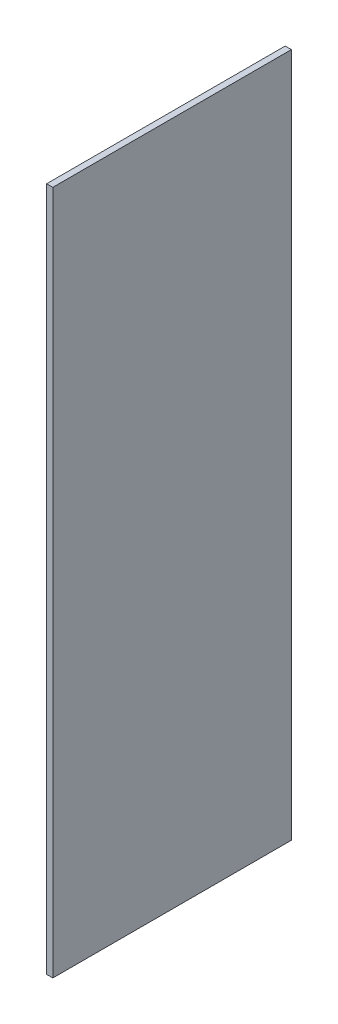
ISO-10303-21;
HEADER;
FILE_DESCRIPTION(('STEP AP214'),'2;1');
FILE_NAME('part.step','',(''),(''),'','','');
FILE_SCHEMA(('AUTOMOTIVE_DESIGN { 1 0 10303 214 1 1 1 1 }'));
ENDSEC;
DATA;
#1=APPLICATION_CONTEXT('core data for automotive mechanical design processes');
#2=APPLICATION_PROTOCOL_DEFINITION('international standard','automotive_design',2000,#1);
#3=PRODUCT_CONTEXT('',#1,'mechanical');
#4=PRODUCT('Part','Part','',(#3));
#5=PRODUCT_RELATED_PRODUCT_CATEGORY('part','',(#4));
#6=PRODUCT_DEFINITION_FORMATION('','',#4);
#7=PRODUCT_DEFINITION_CONTEXT('part definition',#1,'design');
#8=PRODUCT_DEFINITION('design','',#6,#7);
#9=PRODUCT_DEFINITION_SHAPE('','',#8);
#10=(LENGTH_UNIT() NAMED_UNIT(*) SI_UNIT(.MILLI.,.METRE.));
#11=(NAMED_UNIT(*) PLANE_ANGLE_UNIT() SI_UNIT($,.RADIAN.));
#12=(NAMED_UNIT(*) SI_UNIT($,.STERADIAN.) SOLID_ANGLE_UNIT());
#13=UNCERTAINTY_MEASURE_WITH_UNIT(LENGTH_MEASURE(1.E-05),#10,'distance_accuracy_value','');
#14=(GEOMETRIC_REPRESENTATION_CONTEXT(3) GLOBAL_UNCERTAINTY_ASSIGNED_CONTEXT((#13)) GLOBAL_UNIT_ASSIGNED_CONTEXT((#10,
#11,#12)) REPRESENTATION_CONTEXT('',''));
#15=CARTESIAN_POINT('',(0.,0.,0.));
#16=DIRECTION('',(0.,0.,1.));
#17=DIRECTION('',(1.,0.,0.));
#18=AXIS2_PLACEMENT_3D('',#15,#16,#17);
#19=CARTESIAN_POINT('',(4.,0.,0.));
#20=DIRECTION('',(0.,0.,-1.));
#21=DIRECTION('',(-1.,0.,0.));
#22=AXIS2_PLACEMENT_3D('',#19,#20,#21);
#23=PLANE('',#22);
#24=DIRECTION('',(0.,-1.,0.));
#25=VECTOR('',#24,1.);
#26=CARTESIAN_POINT('',(0.,0.,0.));
#27=LINE('',#26,#25);
#28=CARTESIAN_POINT('',(0.,442.,0.));
#29=VERTEX_POINT('',#28);
#30=CARTESIAN_POINT('',(0.,0.,0.));
#31=VERTEX_POINT('',#30);
#32=EDGE_CURVE('E117',#29,#31,#27,.T.);
#33=ORIENTED_EDGE('',*,*,#32,.T.);
#34=DIRECTION('',(-1.,0.,0.));
#35=VECTOR('',#34,1.);
#36=CARTESIAN_POINT('',(4.,0.,0.));
#37=LINE('',#36,#35);
#38=CARTESIAN_POINT('',(4.,0.,0.));
#39=VERTEX_POINT('',#38);
#40=EDGE_CURVE('E11',#39,#31,#37,.T.);
#41=ORIENTED_EDGE('',*,*,#40,.F.);
#42=DIRECTION('',(0.,-1.,0.));
#43=VECTOR('',#42,1.);
#44=CARTESIAN_POINT('',(4.,0.,0.));
#45=LINE('',#44,#43);
#46=CARTESIAN_POINT('',(4.,442.,0.));
#47=VERTEX_POINT('',#46);
#48=EDGE_CURVE('E101',#47,#39,#45,.T.);
#49=ORIENTED_EDGE('',*,*,#48,.F.);
#50=DIRECTION('',(-1.,0.,0.));
#51=VECTOR('',#50,1.);
#52=CARTESIAN_POINT('',(4.,442.,0.));
#53=LINE('',#52,#51);
#54=EDGE_CURVE('E113',#47,#29,#53,.T.);
#55=ORIENTED_EDGE('',*,*,#54,.T.);
#56=EDGE_LOOP('',(#33,#41,#49,#55));
#57=FACE_BOUND('',#56,.T.);
#58=ADVANCED_FACE('F49',(#57),#23,.F.);
#59=CARTESIAN_POINT('',(4.,0.,0.));
#60=DIRECTION('',(0.,1.,0.));
#61=DIRECTION('',(0.,0.,1.));
#62=AXIS2_PLACEMENT_3D('',#59,#60,#61);
#63=PLANE('',#62);
#64=DIRECTION('',(0.,0.,-1.));
#65=VECTOR('',#64,1.);
#66=CARTESIAN_POINT('',(0.,0.,0.));
#67=LINE('',#66,#65);
#68=CARTESIAN_POINT('',(0.,0.,-154.));
#69=VERTEX_POINT('',#68);
#70=EDGE_CURVE('E106',#31,#69,#67,.T.);
#71=ORIENTED_EDGE('',*,*,#70,.T.);
#72=DIRECTION('',(-1.,0.,0.));
#73=VECTOR('',#72,1.);
#74=CARTESIAN_POINT('',(4.,0.,-154.));
#75=LINE('',#74,#73);
#76=CARTESIAN_POINT('',(4.,0.,-154.));
#77=VERTEX_POINT('',#76);
#78=EDGE_CURVE('E58',#77,#69,#75,.T.);
#79=ORIENTED_EDGE('',*,*,#78,.F.);
#80=DIRECTION('',(0.,0.,-1.));
#81=VECTOR('',#80,1.);
#82=CARTESIAN_POINT('',(4.,0.,0.));
#83=LINE('',#82,#81);
#84=EDGE_CURVE('E96',#39,#77,#83,.T.);
#85=ORIENTED_EDGE('',*,*,#84,.F.);
#86=ORIENTED_EDGE('',*,*,#40,.T.);
#87=EDGE_LOOP('',(#71,#79,#85,#86));
#88=FACE_BOUND('',#87,.T.);
#89=ADVANCED_FACE('F105',(#88),#63,.F.);
#90=CARTESIAN_POINT('',(4.,0.,-154.));
#91=DIRECTION('',(0.,0.,1.));
#92=DIRECTION('',(1.,0.,0.));
#93=AXIS2_PLACEMENT_3D('',#90,#91,#92);
#94=PLANE('',#93);
#95=DIRECTION('',(0.,1.,0.));
#96=VECTOR('',#95,1.);
#97=CARTESIAN_POINT('',(0.,0.,-154.));
#98=LINE('',#97,#96);
#99=CARTESIAN_POINT('',(0.,442.,-154.));
#100=VERTEX_POINT('',#99);
#101=EDGE_CURVE('E83',#69,#100,#98,.T.);
#102=ORIENTED_EDGE('',*,*,#101,.T.);
#103=DIRECTION('',(-1.,0.,0.));
#104=VECTOR('',#103,1.);
#105=CARTESIAN_POINT('',(4.,442.,-154.));
#106=LINE('',#105,#104);
#107=CARTESIAN_POINT('',(4.,442.,-154.));
#108=VERTEX_POINT('',#107);
#109=EDGE_CURVE('E108',#108,#100,#106,.T.);
#110=ORIENTED_EDGE('',*,*,#109,.F.);
#111=DIRECTION('',(0.,1.,0.));
#112=VECTOR('',#111,1.);
#113=CARTESIAN_POINT('',(4.,0.,-154.));
#114=LINE('',#113,#112);
#115=EDGE_CURVE('E99',#77,#108,#114,.T.);
#116=ORIENTED_EDGE('',*,*,#115,.F.);
#117=ORIENTED_EDGE('',*,*,#78,.T.);
#118=EDGE_LOOP('',(#102,#110,#116,#117));
#119=FACE_BOUND('',#118,.T.);
#120=ADVANCED_FACE('F109',(#119),#94,.F.);
#121=CARTESIAN_POINT('',(4.,442.,0.));
#122=DIRECTION('',(0.,-1.,0.));
#123=DIRECTION('',(0.,0.,-1.));
#124=AXIS2_PLACEMENT_3D('',#121,#122,#123);
#125=PLANE('',#124);
#126=DIRECTION('',(0.,0.,1.));
#127=VECTOR('',#126,1.);
#128=CARTESIAN_POINT('',(0.,442.,0.));
#129=LINE('',#128,#127);
#130=EDGE_CURVE('E89',#100,#29,#129,.T.);
#131=ORIENTED_EDGE('',*,*,#130,.T.);
#132=ORIENTED_EDGE('',*,*,#54,.F.);
#133=DIRECTION('',(0.,0.,1.));
#134=VECTOR('',#133,1.);
#135=CARTESIAN_POINT('',(4.,442.,0.));
#136=LINE('',#135,#134);
#137=EDGE_CURVE('E66',#108,#47,#136,.T.);
#138=ORIENTED_EDGE('',*,*,#137,.F.);
#139=ORIENTED_EDGE('',*,*,#109,.T.);
#140=EDGE_LOOP('',(#131,#132,#138,#139));
#141=FACE_BOUND('',#140,.T.);
#142=ADVANCED_FACE('F130',(#141),#125,.F.);
#143=CARTESIAN_POINT('',(4.,0.,0.));
#144=DIRECTION('',(-1.,0.,0.));
#145=DIRECTION('',(0.,0.,1.));
#146=AXIS2_PLACEMENT_3D('',#143,#144,#145);
#147=PLANE('',#146);
#148=ORIENTED_EDGE('',*,*,#48,.T.);
#149=ORIENTED_EDGE('',*,*,#84,.T.);
#150=ORIENTED_EDGE('',*,*,#115,.T.);
#151=ORIENTED_EDGE('',*,*,#137,.T.);
#152=EDGE_LOOP('',(#148,#149,#150,#151));
#153=FACE_BOUND('',#152,.T.);
#154=ADVANCED_FACE('F97',(#153),#147,.F.);
#155=CARTESIAN_POINT('',(0.,0.,0.));
#156=DIRECTION('',(-1.,0.,0.));
#157=DIRECTION('',(0.,0.,1.));
#158=AXIS2_PLACEMENT_3D('',#155,#156,#157);
#159=PLANE('',#158);
#160=ORIENTED_EDGE('',*,*,#32,.F.);
#161=ORIENTED_EDGE('',*,*,#130,.F.);
#162=ORIENTED_EDGE('',*,*,#101,.F.);
#163=ORIENTED_EDGE('',*,*,#70,.F.);
#164=EDGE_LOOP('',(#160,#161,#162,#163));
#165=FACE_BOUND('',#164,.T.);
#166=ADVANCED_FACE('F133',(#165),#159,.T.);
#167=CLOSED_SHELL('',(#58,#89,#120,#142,#154,#166));
#168=MANIFOLD_SOLID_BREP('B2',#167);
#169=ADVANCED_BREP_SHAPE_REPRESENTATION('',(#18,#168),#14);
#170=SHAPE_DEFINITION_REPRESENTATION(#9,#169);
ENDSEC;
END-ISO-10303-21;
